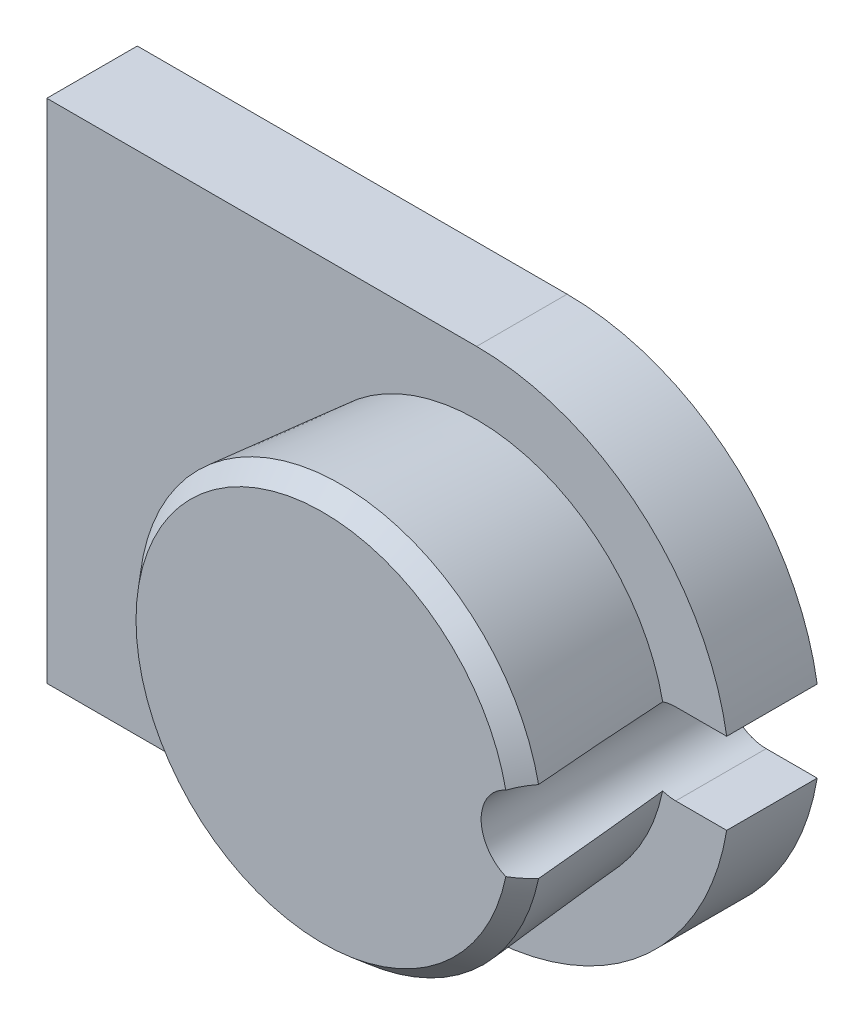
ISO-10303-21;
HEADER;
FILE_DESCRIPTION(('STEP AP214'),'2;1');
FILE_NAME('part.step','',(''),(''),'','','');
FILE_SCHEMA(('AUTOMOTIVE_DESIGN { 1 0 10303 214 1 1 1 1 }'));
ENDSEC;
DATA;
#1=APPLICATION_CONTEXT('core data for automotive mechanical design processes');
#2=APPLICATION_PROTOCOL_DEFINITION('international standard','automotive_design',2000,#1);
#3=PRODUCT_CONTEXT('',#1,'mechanical');
#4=PRODUCT('Part','Part','',(#3));
#5=PRODUCT_RELATED_PRODUCT_CATEGORY('part','',(#4));
#6=PRODUCT_DEFINITION_FORMATION('','',#4);
#7=PRODUCT_DEFINITION_CONTEXT('part definition',#1,'design');
#8=PRODUCT_DEFINITION('design','',#6,#7);
#9=PRODUCT_DEFINITION_SHAPE('','',#8);
#10=(LENGTH_UNIT() NAMED_UNIT(*) SI_UNIT(.MILLI.,.METRE.));
#11=(NAMED_UNIT(*) PLANE_ANGLE_UNIT() SI_UNIT($,.RADIAN.));
#12=(NAMED_UNIT(*) SI_UNIT($,.STERADIAN.) SOLID_ANGLE_UNIT());
#13=UNCERTAINTY_MEASURE_WITH_UNIT(LENGTH_MEASURE(1.E-05),#10,'distance_accuracy_value','');
#14=(GEOMETRIC_REPRESENTATION_CONTEXT(3) GLOBAL_UNCERTAINTY_ASSIGNED_CONTEXT((#13)) GLOBAL_UNIT_ASSIGNED_CONTEXT((#10,
#11,#12)) REPRESENTATION_CONTEXT('',''));
#15=CARTESIAN_POINT('',(0.,0.,0.));
#16=DIRECTION('',(0.,0.,1.));
#17=DIRECTION('',(1.,0.,0.));
#18=AXIS2_PLACEMENT_3D('',#15,#16,#17);
#19=CARTESIAN_POINT('',(65.5,17.,3.2));
#20=DIRECTION('',(0.,0.,1.));
#21=DIRECTION('',(1.,0.,0.));
#22=AXIS2_PLACEMENT_3D('',#19,#20,#21);
#23=CYLINDRICAL_SURFACE('',#22,2.8);
#24=DIRECTION('',(0.,0.,1.));
#25=VECTOR('',#24,1.);
#26=CARTESIAN_POINT('',(68.2636027210871,16.55,3.2));
#27=LINE('',#26,#25);
#28=CARTESIAN_POINT('',(68.2636027210871,16.55,4.2));
#29=VERTEX_POINT('',#28);
#30=CARTESIAN_POINT('',(68.2636027210871,16.55,3.2));
#31=VERTEX_POINT('',#30);
#32=EDGE_CURVE('E251',#29,#31,#27,.F.);
#33=ORIENTED_EDGE('',*,*,#32,.F.);
#34=CARTESIAN_POINT('',(65.5,17.,4.2));
#35=DIRECTION('',(0.,0.,1.));
#36=DIRECTION('',(-1.,0.,0.));
#37=AXIS2_PLACEMENT_3D('',#34,#35,#36);
#38=CIRCLE('',#37,2.8);
#39=CARTESIAN_POINT('',(65.5,14.2,4.2));
#40=VERTEX_POINT('',#39);
#41=EDGE_CURVE('E210',#40,#29,#38,.T.);
#42=ORIENTED_EDGE('',*,*,#41,.F.);
#43=DIRECTION('',(0.,0.,1.));
#44=VECTOR('',#43,1.);
#45=CARTESIAN_POINT('',(65.5,14.2,3.2));
#46=LINE('',#45,#44);
#47=CARTESIAN_POINT('',(65.5,14.2,3.2));
#48=VERTEX_POINT('',#47);
#49=EDGE_CURVE('E224',#48,#40,#46,.T.);
#50=ORIENTED_EDGE('',*,*,#49,.F.);
#51=CARTESIAN_POINT('',(65.5,17.,3.2));
#52=DIRECTION('',(0.,0.,1.));
#53=DIRECTION('',(-1.,0.,0.));
#54=AXIS2_PLACEMENT_3D('',#51,#52,#53);
#55=CIRCLE('',#54,2.8);
#56=EDGE_CURVE('E257',#48,#31,#55,.T.);
#57=ORIENTED_EDGE('',*,*,#56,.T.);
#58=EDGE_LOOP('',(#33,#42,#50,#57));
#59=FACE_BOUND('',#58,.T.);
#60=ADVANCED_FACE('F41',(#59),#23,.T.);
#61=CARTESIAN_POINT('',(60.75,14.2,3.2));
#62=DIRECTION('',(-1.,0.,0.));
#63=DIRECTION('',(0.,0.,1.));
#64=AXIS2_PLACEMENT_3D('',#61,#62,#63);
#65=PLANE('',#64);
#66=DIRECTION('',(0.,-1.,0.));
#67=VECTOR('',#66,1.);
#68=CARTESIAN_POINT('',(60.75,14.2,4.2));
#69=LINE('',#68,#67);
#70=CARTESIAN_POINT('',(60.75,19.8,4.2));
#71=VERTEX_POINT('',#70);
#72=CARTESIAN_POINT('',(60.75,14.2,4.2));
#73=VERTEX_POINT('',#72);
#74=EDGE_CURVE('E215',#71,#73,#69,.T.);
#75=ORIENTED_EDGE('',*,*,#74,.F.);
#76=DIRECTION('',(0.,0.,1.));
#77=VECTOR('',#76,1.);
#78=CARTESIAN_POINT('',(60.75,19.8,3.2));
#79=LINE('',#78,#77);
#80=CARTESIAN_POINT('',(60.75,19.8,3.2));
#81=VERTEX_POINT('',#80);
#82=EDGE_CURVE('E67',#81,#71,#79,.T.);
#83=ORIENTED_EDGE('',*,*,#82,.F.);
#84=DIRECTION('',(0.,-1.,0.));
#85=VECTOR('',#84,1.);
#86=CARTESIAN_POINT('',(60.75,14.2,3.2));
#87=LINE('',#86,#85);
#88=CARTESIAN_POINT('',(60.75,14.2,3.2));
#89=VERTEX_POINT('',#88);
#90=EDGE_CURVE('E220',#81,#89,#87,.T.);
#91=ORIENTED_EDGE('',*,*,#90,.T.);
#92=DIRECTION('',(0.,0.,1.));
#93=VECTOR('',#92,1.);
#94=CARTESIAN_POINT('',(60.75,14.2,3.2));
#95=LINE('',#94,#93);
#96=EDGE_CURVE('E93',#89,#73,#95,.T.);
#97=ORIENTED_EDGE('',*,*,#96,.T.);
#98=EDGE_LOOP('',(#75,#83,#91,#97));
#99=FACE_BOUND('',#98,.T.);
#100=ADVANCED_FACE('F261',(#99),#65,.T.);
#101=CARTESIAN_POINT('',(60.75,19.8,3.2));
#102=DIRECTION('',(0.,1.,0.));
#103=DIRECTION('',(-1.,0.,0.));
#104=AXIS2_PLACEMENT_3D('',#101,#102,#103);
#105=PLANE('',#104);
#106=DIRECTION('',(-1.,0.,0.));
#107=VECTOR('',#106,1.);
#108=CARTESIAN_POINT('',(60.75,19.8,4.2));
#109=LINE('',#108,#107);
#110=CARTESIAN_POINT('',(65.5,19.8,4.2));
#111=VERTEX_POINT('',#110);
#112=EDGE_CURVE('E213',#111,#71,#109,.T.);
#113=ORIENTED_EDGE('',*,*,#112,.F.);
#114=DIRECTION('',(0.,0.,1.));
#115=VECTOR('',#114,1.);
#116=CARTESIAN_POINT('',(65.5,19.8,3.2));
#117=LINE('',#116,#115);
#118=CARTESIAN_POINT('',(65.5,19.8,3.2));
#119=VERTEX_POINT('',#118);
#120=EDGE_CURVE('E209',#119,#111,#117,.T.);
#121=ORIENTED_EDGE('',*,*,#120,.F.);
#122=DIRECTION('',(-1.,0.,0.));
#123=VECTOR('',#122,1.);
#124=CARTESIAN_POINT('',(60.75,19.8,3.2));
#125=LINE('',#124,#123);
#126=EDGE_CURVE('E227',#119,#81,#125,.T.);
#127=ORIENTED_EDGE('',*,*,#126,.T.);
#128=ORIENTED_EDGE('',*,*,#82,.T.);
#129=EDGE_LOOP('',(#113,#121,#127,#128));
#130=FACE_BOUND('',#129,.T.);
#131=ADVANCED_FACE('F268',(#130),#105,.T.);
#132=DIRECTION('',(0.,0.,1.));
#133=VECTOR('',#132,1.);
#134=CARTESIAN_POINT('',(68.2636027210871,17.45,3.2));
#135=LINE('',#134,#133);
#136=CARTESIAN_POINT('',(68.2636027210871,17.45,3.2));
#137=VERTEX_POINT('',#136);
#138=CARTESIAN_POINT('',(68.2636027210871,17.45,4.2));
#139=VERTEX_POINT('',#138);
#140=EDGE_CURVE('E207',#137,#139,#135,.T.);
#141=ORIENTED_EDGE('',*,*,#140,.F.);
#142=EDGE_CURVE('E156',#137,#119,#55,.T.);
#143=ORIENTED_EDGE('',*,*,#142,.T.);
#144=ORIENTED_EDGE('',*,*,#120,.T.);
#145=EDGE_CURVE('E202',#139,#111,#38,.T.);
#146=ORIENTED_EDGE('',*,*,#145,.F.);
#147=EDGE_LOOP('',(#141,#143,#144,#146));
#148=FACE_BOUND('',#147,.T.);
#149=ADVANCED_FACE('F206',(#148),#23,.T.);
#150=CARTESIAN_POINT('',(65.5,14.2,3.2));
#151=DIRECTION('',(0.,-1.,0.));
#152=DIRECTION('',(1.,0.,0.));
#153=AXIS2_PLACEMENT_3D('',#150,#151,#152);
#154=PLANE('',#153);
#155=DIRECTION('',(1.,0.,0.));
#156=VECTOR('',#155,1.);
#157=CARTESIAN_POINT('',(65.5,14.2,4.2));
#158=LINE('',#157,#156);
#159=EDGE_CURVE('E211',#73,#40,#158,.T.);
#160=ORIENTED_EDGE('',*,*,#159,.F.);
#161=ORIENTED_EDGE('',*,*,#96,.F.);
#162=DIRECTION('',(1.,0.,0.));
#163=VECTOR('',#162,1.);
#164=CARTESIAN_POINT('',(65.5,14.2,3.2));
#165=LINE('',#164,#163);
#166=EDGE_CURVE('E255',#89,#48,#165,.T.);
#167=ORIENTED_EDGE('',*,*,#166,.T.);
#168=ORIENTED_EDGE('',*,*,#49,.T.);
#169=EDGE_LOOP('',(#160,#161,#167,#168));
#170=FACE_BOUND('',#169,.T.);
#171=ADVANCED_FACE('F262',(#170),#154,.T.);
#172=CARTESIAN_POINT('',(65.5,17.,3.2));
#173=DIRECTION('',(0.,0.,-1.));
#174=DIRECTION('',(-1.,0.,0.));
#175=AXIS2_PLACEMENT_3D('',#172,#173,#174);
#176=PLANE('',#175);
#177=DIRECTION('',(1.,0.,0.));
#178=VECTOR('',#177,1.);
#179=CARTESIAN_POINT('',(69.3245850464251,16.55,3.2));
#180=LINE('',#179,#178);
#181=CARTESIAN_POINT('',(67.7,16.55,3.2));
#182=VERTEX_POINT('',#181);
#183=EDGE_CURVE('E143',#182,#31,#180,.T.);
#184=ORIENTED_EDGE('',*,*,#183,.T.);
#185=ORIENTED_EDGE('',*,*,#56,.F.);
#186=ORIENTED_EDGE('',*,*,#166,.F.);
#187=ORIENTED_EDGE('',*,*,#90,.F.);
#188=ORIENTED_EDGE('',*,*,#126,.F.);
#189=ORIENTED_EDGE('',*,*,#142,.F.);
#190=DIRECTION('',(-1.,0.,0.));
#191=VECTOR('',#190,1.);
#192=CARTESIAN_POINT('',(69.3245850464251,17.45,3.2));
#193=LINE('',#192,#191);
#194=CARTESIAN_POINT('',(67.7,17.45,3.2));
#195=VERTEX_POINT('',#194);
#196=EDGE_CURVE('E138',#137,#195,#193,.T.);
#197=ORIENTED_EDGE('',*,*,#196,.T.);
#198=CARTESIAN_POINT('',(67.7,17.,3.2));
#199=DIRECTION('',(0.,0.,1.));
#200=DIRECTION('',(1.,0.,0.));
#201=AXIS2_PLACEMENT_3D('',#198,#199,#200);
#202=CIRCLE('',#201,0.450000000000003);
#203=EDGE_CURVE('E146',#195,#182,#202,.T.);
#204=ORIENTED_EDGE('',*,*,#203,.T.);
#205=EDGE_LOOP('',(#184,#185,#186,#187,#188,#189,#197,#204));
#206=FACE_BOUND('',#205,.T.);
#207=ADVANCED_FACE('F154',(#206),#176,.T.);
#208=CARTESIAN_POINT('',(65.5,17.,4.2));
#209=DIRECTION('',(0.,0.,-1.));
#210=DIRECTION('',(-1.,0.,0.));
#211=AXIS2_PLACEMENT_3D('',#208,#209,#210);
#212=PLANE('',#211);
#213=ORIENTED_EDGE('',*,*,#41,.T.);
#214=DIRECTION('',(-1.,0.,0.));
#215=VECTOR('',#214,1.);
#216=CARTESIAN_POINT('',(65.5,16.55,4.2));
#217=LINE('',#216,#215);
#218=CARTESIAN_POINT('',(67.7,16.55,4.2));
#219=VERTEX_POINT('',#218);
#220=EDGE_CURVE('E11',#29,#219,#217,.T.);
#221=ORIENTED_EDGE('',*,*,#220,.T.);
#222=CARTESIAN_POINT('',(67.7,17.,4.2));
#223=DIRECTION('',(0.,0.,-1.));
#224=DIRECTION('',(-1.,0.,0.));
#225=AXIS2_PLACEMENT_3D('',#222,#223,#224);
#226=CIRCLE('',#225,0.450000000000003);
#227=CARTESIAN_POINT('',(67.55625,16.5735777474146,4.2));
#228=VERTEX_POINT('',#227);
#229=EDGE_CURVE('E244',#219,#228,#226,.T.);
#230=ORIENTED_EDGE('',*,*,#229,.T.);
#231=CARTESIAN_POINT('',(65.5,17.,4.2));
#232=DIRECTION('',(0.,0.,1.));
#233=DIRECTION('',(1.,0.,0.));
#234=AXIS2_PLACEMENT_3D('',#231,#232,#233);
#235=CIRCLE('',#234,2.1);
#236=CARTESIAN_POINT('',(67.55625,17.4264222525854,4.2));
#237=VERTEX_POINT('',#236);
#238=EDGE_CURVE('E222',#237,#228,#235,.T.);
#239=ORIENTED_EDGE('',*,*,#238,.F.);
#240=CARTESIAN_POINT('',(67.7,17.45,4.2));
#241=VERTEX_POINT('',#240);
#242=EDGE_CURVE('E170',#237,#241,#226,.T.);
#243=ORIENTED_EDGE('',*,*,#242,.T.);
#244=DIRECTION('',(1.,0.,0.));
#245=VECTOR('',#244,1.);
#246=CARTESIAN_POINT('',(65.5,17.45,4.2));
#247=LINE('',#246,#245);
#248=EDGE_CURVE('E51',#241,#139,#247,.T.);
#249=ORIENTED_EDGE('',*,*,#248,.T.);
#250=ORIENTED_EDGE('',*,*,#145,.T.);
#251=ORIENTED_EDGE('',*,*,#112,.T.);
#252=ORIENTED_EDGE('',*,*,#74,.T.);
#253=ORIENTED_EDGE('',*,*,#159,.T.);
#254=EDGE_LOOP('',(#213,#221,#230,#239,#243,#249,#250,#251,#252,#253));
#255=FACE_BOUND('',#254,.T.);
#256=ADVANCED_FACE('F200',(#255),#212,.F.);
#257=CARTESIAN_POINT('',(65.5,17.,4.2));
#258=DIRECTION('',(0.,0.,1.));
#259=DIRECTION('',(1.,0.,0.));
#260=AXIS2_PLACEMENT_3D('',#257,#258,#259);
#261=CONICAL_SURFACE('',#260,2.1,0.0872664625997165);
#262=CARTESIAN_POINT('',(65.5,17.,5.70076106038165));
#263=DIRECTION('',(0.,0.,1.));
#264=DIRECTION('',(1.,0.,0.));
#265=AXIS2_PLACEMENT_3D('',#262,#263,#264);
#266=CIRCLE('',#265,2.23129957944454);
#267=CARTESIAN_POINT('',(67.6854995030067,16.5502336878034,5.70076106038165));
#268=VERTEX_POINT('',#267);
#269=CARTESIAN_POINT('',(67.6854995030067,17.4497663121966,5.70076106038165));
#270=VERTEX_POINT('',#269);
#271=EDGE_CURVE('E230',#268,#270,#266,.F.);
#272=ORIENTED_EDGE('',*,*,#271,.T.);
#273=CARTESIAN_POINT('',(67.6855172497506,17.4497668840024,5.70096106038165));
#274=CARTESIAN_POINT('',(67.6589984514179,17.4488757647441,5.40210418712045));
#275=CARTESIAN_POINT('',(67.6329455846885,17.4457403829769,5.10324495834483));
#276=CARTESIAN_POINT('',(67.59010500644,17.4367331661913,4.60285665375593));
#277=CARTESIAN_POINT('',(67.5730632224815,17.4320851272104,4.40132886240432));
#278=CARTESIAN_POINT('',(67.5562332976872,17.4264166217581,4.19979999999999));
#279=B_SPLINE_CURVE_WITH_KNOTS('',3,(#273,#274,#275,#276,#277,#278),.UNSPECIFIED.,.F.,.F.,(4,2,
4),(0.,0.900027105131824,1.50692849430902),.UNSPECIFIED.);
#280=EDGE_CURVE('E58',#270,#237,#279,.T.);
#281=ORIENTED_EDGE('',*,*,#280,.T.);
#282=ORIENTED_EDGE('',*,*,#238,.T.);
#283=CARTESIAN_POINT('',(67.5562332976884,16.5735833782479,4.1998));
#284=CARTESIAN_POINT('',(67.5811926646664,16.5651712042976,4.49867394948134));
#285=CARTESIAN_POINT('',(67.6066174717391,16.5590067883763,4.79753990644811));
#286=CARTESIAN_POINT('',(67.6499659259679,16.5524490655288,5.29792256827331));
#287=CARTESIAN_POINT('',(67.6676357695823,16.5508300606983,5.49944363143377));
#288=CARTESIAN_POINT('',(67.6855172497496,16.5502331159923,5.70096106038168));
#289=B_SPLINE_CURVE_WITH_KNOTS('',3,(#283,#284,#285,#286,#287,#288),.UNSPECIFIED.,.F.,.F.,(4,2,
4),(0.,0.900026404972646,1.50692858080155),.UNSPECIFIED.);
#290=EDGE_CURVE('E241',#228,#268,#289,.T.);
#291=ORIENTED_EDGE('',*,*,#290,.T.);
#292=EDGE_LOOP('',(#272,#281,#282,#291));
#293=FACE_BOUND('',#292,.T.);
#294=ADVANCED_FACE('F172',(#293),#261,.T.);
#295=CARTESIAN_POINT('',(65.5,17.,5.9));
#296=DIRECTION('',(0.,0.,1.));
#297=DIRECTION('',(1.,0.,0.));
#298=AXIS2_PLACEMENT_3D('',#295,#296,#297);
#299=PLANE('',#298);
#300=CARTESIAN_POINT('',(67.7,17.,5.9));
#301=DIRECTION('',(0.,0.,1.));
#302=DIRECTION('',(1.,0.,0.));
#303=AXIS2_PLACEMENT_3D('',#300,#301,#302);
#304=CIRCLE('',#303,0.450000000000003);
#305=CARTESIAN_POINT('',(67.5222918604265,17.4134244999142,5.9));
#306=VERTEX_POINT('',#305);
#307=CARTESIAN_POINT('',(67.5222918604265,16.5865755000858,5.9));
#308=VERTEX_POINT('',#307);
#309=EDGE_CURVE('E157',#306,#308,#304,.T.);
#310=ORIENTED_EDGE('',*,*,#309,.F.);
#311=CARTESIAN_POINT('',(65.5,17.,5.9));
#312=DIRECTION('',(0.,0.,1.));
#313=DIRECTION('',(1.,0.,0.));
#314=AXIS2_PLACEMENT_3D('',#311,#312,#313);
#315=CIRCLE('',#314,2.06411825869462);
#316=EDGE_CURVE('E228',#306,#308,#315,.T.);
#317=ORIENTED_EDGE('',*,*,#316,.T.);
#318=EDGE_LOOP('',(#310,#317));
#319=FACE_BOUND('',#318,.T.);
#320=ADVANCED_FACE('F240',(#319),#299,.T.);
#321=CARTESIAN_POINT('',(65.5,17.,5.9));
#322=DIRECTION('',(0.,0.,-1.));
#323=DIRECTION('',(-1.,0.,0.));
#324=AXIS2_PLACEMENT_3D('',#321,#322,#323);
#325=CONICAL_SURFACE('',#324,2.06411825869462,0.698131700797759);
#326=CARTESIAN_POINT('',(67.5221344122028,16.5866432138242,5.9002));
#327=CARTESIAN_POINT('',(67.5482955985537,16.5754454286302,5.86696559813146));
#328=CARTESIAN_POINT('',(67.5750041337564,16.5668119542437,5.83371181893398));
#329=CARTESIAN_POINT('',(67.6295159019909,16.5546736270576,5.76716550572803));
#330=CARTESIAN_POINT('',(67.6573191350278,16.5511687742816,5.73387297171939));
#331=CARTESIAN_POINT('',(67.6856697169215,16.5502282323368,5.70056106038163));
#332=B_SPLINE_CURVE_WITH_KNOTS('',3,(#326,#327,#328,#329,#330,#331),.UNSPECIFIED.,.F.,.F.,(4,2,
4),(0.,0.130549871972949,0.261099744546601),.UNSPECIFIED.);
#333=EDGE_CURVE('E192',#308,#268,#332,.T.);
#334=ORIENTED_EDGE('',*,*,#333,.F.);
#335=ORIENTED_EDGE('',*,*,#316,.F.);
#336=CARTESIAN_POINT('',(67.6856697169215,17.4497717676632,5.70056106038163));
#337=CARTESIAN_POINT('',(67.6573191350278,17.4488312257184,5.73387297171939));
#338=CARTESIAN_POINT('',(67.6295159019909,17.4453263729424,5.76716550572803));
#339=CARTESIAN_POINT('',(67.5750041337564,17.4331880457563,5.83371181893398));
#340=CARTESIAN_POINT('',(67.5482955985537,17.4245545713698,5.86696559813146));
#341=CARTESIAN_POINT('',(67.5221344122028,17.4133567861758,5.9002));
#342=B_SPLINE_CURVE_WITH_KNOTS('',3,(#336,#337,#338,#339,#340,#341),.UNSPECIFIED.,.F.,.F.,(4,2,
4),(0.,0.130549872573653,0.261099744546603),.UNSPECIFIED.);
#343=EDGE_CURVE('E184',#270,#306,#342,.T.);
#344=ORIENTED_EDGE('',*,*,#343,.F.);
#345=ORIENTED_EDGE('',*,*,#271,.F.);
#346=EDGE_LOOP('',(#334,#335,#344,#345));
#347=FACE_BOUND('',#346,.T.);
#348=ADVANCED_FACE('F44',(#347),#325,.T.);
#349=CARTESIAN_POINT('',(67.7,17.,3.2));
#350=DIRECTION('',(0.,0.,1.));
#351=DIRECTION('',(1.,0.,0.));
#352=AXIS2_PLACEMENT_3D('',#349,#350,#351);
#353=CYLINDRICAL_SURFACE('',#352,0.450000000000003);
#354=DIRECTION('',(0.,0.,1.));
#355=VECTOR('',#354,1.);
#356=CARTESIAN_POINT('',(67.7,16.55,3.2));
#357=LINE('',#356,#355);
#358=EDGE_CURVE('E142',#182,#219,#357,.T.);
#359=ORIENTED_EDGE('',*,*,#358,.F.);
#360=ORIENTED_EDGE('',*,*,#203,.F.);
#361=DIRECTION('',(0.,0.,1.));
#362=VECTOR('',#361,1.);
#363=CARTESIAN_POINT('',(67.7,17.45,3.2));
#364=LINE('',#363,#362);
#365=EDGE_CURVE('E134',#195,#241,#364,.T.);
#366=ORIENTED_EDGE('',*,*,#365,.T.);
#367=ORIENTED_EDGE('',*,*,#242,.F.);
#368=ORIENTED_EDGE('',*,*,#280,.F.);
#369=ORIENTED_EDGE('',*,*,#343,.T.);
#370=ORIENTED_EDGE('',*,*,#309,.T.);
#371=ORIENTED_EDGE('',*,*,#333,.T.);
#372=ORIENTED_EDGE('',*,*,#290,.F.);
#373=ORIENTED_EDGE('',*,*,#229,.F.);
#374=EDGE_LOOP('',(#359,#360,#366,#367,#368,#369,#370,#371,#372,#373));
#375=FACE_BOUND('',#374,.T.);
#376=ADVANCED_FACE('F147',(#375),#353,.F.);
#377=CARTESIAN_POINT('',(69.3245850464251,16.55,3.2));
#378=DIRECTION('',(0.,-1.,0.));
#379=DIRECTION('',(0.,0.,-1.));
#380=AXIS2_PLACEMENT_3D('',#377,#378,#379);
#381=PLANE('',#380);
#382=ORIENTED_EDGE('',*,*,#32,.T.);
#383=ORIENTED_EDGE('',*,*,#183,.F.);
#384=ORIENTED_EDGE('',*,*,#358,.T.);
#385=ORIENTED_EDGE('',*,*,#220,.F.);
#386=EDGE_LOOP('',(#382,#383,#384,#385));
#387=FACE_BOUND('',#386,.T.);
#388=ADVANCED_FACE('F180',(#387),#381,.F.);
#389=CARTESIAN_POINT('',(69.3245850464251,17.45,3.2));
#390=DIRECTION('',(0.,1.,0.));
#391=DIRECTION('',(0.,0.,1.));
#392=AXIS2_PLACEMENT_3D('',#389,#390,#391);
#393=PLANE('',#392);
#394=ORIENTED_EDGE('',*,*,#140,.T.);
#395=ORIENTED_EDGE('',*,*,#248,.F.);
#396=ORIENTED_EDGE('',*,*,#365,.F.);
#397=ORIENTED_EDGE('',*,*,#196,.F.);
#398=EDGE_LOOP('',(#394,#395,#396,#397));
#399=FACE_BOUND('',#398,.T.);
#400=ADVANCED_FACE('F136',(#399),#393,.F.);
#401=CLOSED_SHELL('',(#60,#100,#131,#149,#171,#207,#256,#294,#320,#348,#376,#388,#400));
#402=MANIFOLD_SOLID_BREP('B2',#401);
#403=ADVANCED_BREP_SHAPE_REPRESENTATION('',(#18,#402),#14);
#404=SHAPE_DEFINITION_REPRESENTATION(#9,#403);
ENDSEC;
END-ISO-10303-21;
